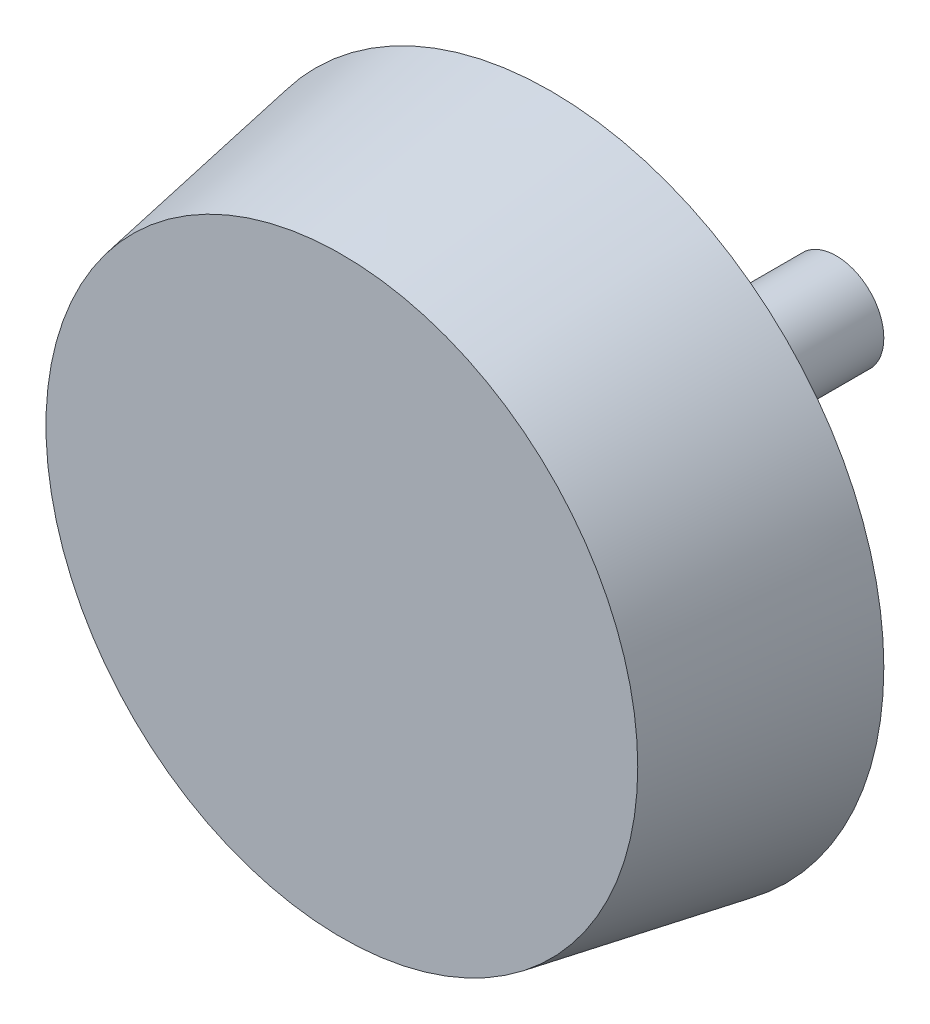
ISO-10303-21;
HEADER;
FILE_DESCRIPTION(('STEP AP214'),'2;1');
FILE_NAME('part.step','',(''),(''),'','','');
FILE_SCHEMA(('AUTOMOTIVE_DESIGN { 1 0 10303 214 1 1 1 1 }'));
ENDSEC;
DATA;
#1=APPLICATION_CONTEXT('core data for automotive mechanical design processes');
#2=APPLICATION_PROTOCOL_DEFINITION('international standard','automotive_design',2000,#1);
#3=PRODUCT_CONTEXT('',#1,'mechanical');
#4=PRODUCT('Part','Part','',(#3));
#5=PRODUCT_RELATED_PRODUCT_CATEGORY('part','',(#4));
#6=PRODUCT_DEFINITION_FORMATION('','',#4);
#7=PRODUCT_DEFINITION_CONTEXT('part definition',#1,'design');
#8=PRODUCT_DEFINITION('design','',#6,#7);
#9=PRODUCT_DEFINITION_SHAPE('','',#8);
#10=(LENGTH_UNIT() NAMED_UNIT(*) SI_UNIT(.MILLI.,.METRE.));
#11=(NAMED_UNIT(*) PLANE_ANGLE_UNIT() SI_UNIT($,.RADIAN.));
#12=(NAMED_UNIT(*) SI_UNIT($,.STERADIAN.) SOLID_ANGLE_UNIT());
#13=UNCERTAINTY_MEASURE_WITH_UNIT(LENGTH_MEASURE(1.E-05),#10,'distance_accuracy_value','');
#14=(GEOMETRIC_REPRESENTATION_CONTEXT(3) GLOBAL_UNCERTAINTY_ASSIGNED_CONTEXT((#13)) GLOBAL_UNIT_ASSIGNED_CONTEXT((#10,
#11,#12)) REPRESENTATION_CONTEXT('',''));
#15=CARTESIAN_POINT('',(0.,0.,0.));
#16=DIRECTION('',(0.,0.,1.));
#17=DIRECTION('',(1.,0.,0.));
#18=AXIS2_PLACEMENT_3D('',#15,#16,#17);
#19=CARTESIAN_POINT('',(0.,0.,0.));
#20=DIRECTION('',(0.,0.,1.));
#21=DIRECTION('',(1.,0.,0.));
#22=AXIS2_PLACEMENT_3D('',#19,#20,#21);
#23=PLANE('',#22);
#24=CARTESIAN_POINT('',(0.,0.,0.));
#25=DIRECTION('',(0.,0.,1.));
#26=DIRECTION('',(1.,0.,0.));
#27=AXIS2_PLACEMENT_3D('',#24,#25,#26);
#28=CIRCLE('',#27,35.);
#29=CARTESIAN_POINT('',(35.,0.,0.));
#30=VERTEX_POINT('',#29);
#31=EDGE_CURVE('E41',#30,#30,#28,.T.);
#32=ORIENTED_EDGE('',*,*,#31,.F.);
#33=EDGE_LOOP('',(#32));
#34=FACE_BOUND('',#33,.T.);
#35=CARTESIAN_POINT('',(0.,0.,0.));
#36=DIRECTION('',(0.,0.,1.));
#37=DIRECTION('',(1.,0.,0.));
#38=AXIS2_PLACEMENT_3D('',#35,#36,#37);
#39=CIRCLE('',#38,5.);
#40=CARTESIAN_POINT('',(5.,0.,0.));
#41=VERTEX_POINT('',#40);
#42=EDGE_CURVE('E10',#41,#41,#39,.F.);
#43=ORIENTED_EDGE('',*,*,#42,.F.);
#44=EDGE_LOOP('',(#43));
#45=FACE_BOUND('',#44,.T.);
#46=ADVANCED_FACE('F30',(#34,#45),#23,.F.);
#47=CARTESIAN_POINT('',(0.,0.,0.));
#48=DIRECTION('',(0.,0.,-1.));
#49=DIRECTION('',(1.,0.,0.));
#50=AXIS2_PLACEMENT_3D('',#47,#48,#49);
#51=CONICAL_SURFACE('',#50,35.,0.174532925199433);
#52=CARTESIAN_POINT('',(0.,0.,22.));
#53=DIRECTION('',(0.,0.,1.));
#54=DIRECTION('',(1.,0.,0.));
#55=AXIS2_PLACEMENT_3D('',#52,#53,#54);
#56=CIRCLE('',#55,31.1208064244138);
#57=CARTESIAN_POINT('',(31.1208064244138,0.,22.));
#58=VERTEX_POINT('',#57);
#59=EDGE_CURVE('E37',#58,#58,#56,.T.);
#60=ORIENTED_EDGE('',*,*,#59,.F.);
#61=EDGE_LOOP('',(#60));
#62=FACE_BOUND('',#61,.T.);
#63=ORIENTED_EDGE('',*,*,#31,.T.);
#64=EDGE_LOOP('',(#63));
#65=FACE_BOUND('',#64,.T.);
#66=ADVANCED_FACE('F32',(#62,#65),#51,.T.);
#67=CARTESIAN_POINT('',(0.,0.,22.));
#68=DIRECTION('',(0.,0.,1.));
#69=DIRECTION('',(1.,0.,0.));
#70=AXIS2_PLACEMENT_3D('',#67,#68,#69);
#71=PLANE('',#70);
#72=ORIENTED_EDGE('',*,*,#59,.T.);
#73=EDGE_LOOP('',(#72));
#74=FACE_BOUND('',#73,.T.);
#75=ADVANCED_FACE('F55',(#74),#71,.T.);
#76=CARTESIAN_POINT('',(0.,0.,-30.));
#77=DIRECTION('',(0.,0.,1.));
#78=DIRECTION('',(1.,0.,0.));
#79=AXIS2_PLACEMENT_3D('',#76,#77,#78);
#80=CYLINDRICAL_SURFACE('',#79,5.);
#81=CARTESIAN_POINT('',(0.,0.,-30.));
#82=DIRECTION('',(0.,0.,-1.));
#83=DIRECTION('',(-1.,0.,0.));
#84=AXIS2_PLACEMENT_3D('',#81,#82,#83);
#85=CIRCLE('',#84,5.);
#86=CARTESIAN_POINT('',(-5.,0.,-30.));
#87=VERTEX_POINT('',#86);
#88=EDGE_CURVE('E45',#87,#87,#85,.T.);
#89=ORIENTED_EDGE('',*,*,#88,.F.);
#90=EDGE_LOOP('',(#89));
#91=FACE_BOUND('',#90,.T.);
#92=ORIENTED_EDGE('',*,*,#42,.T.);
#93=EDGE_LOOP('',(#92));
#94=FACE_BOUND('',#93,.T.);
#95=ADVANCED_FACE('F53',(#91,#94),#80,.T.);
#96=CARTESIAN_POINT('',(0.,0.,-30.));
#97=DIRECTION('',(0.,0.,-1.));
#98=DIRECTION('',(-1.,0.,0.));
#99=AXIS2_PLACEMENT_3D('',#96,#97,#98);
#100=PLANE('',#99);
#101=ORIENTED_EDGE('',*,*,#88,.T.);
#102=EDGE_LOOP('',(#101));
#103=FACE_BOUND('',#102,.T.);
#104=ADVANCED_FACE('F51',(#103),#100,.T.);
#105=CLOSED_SHELL('',(#46,#66,#75,#95,#104));
#106=MANIFOLD_SOLID_BREP('B2',#105);
#107=ADVANCED_BREP_SHAPE_REPRESENTATION('',(#18,#106),#14);
#108=SHAPE_DEFINITION_REPRESENTATION(#9,#107);
ENDSEC;
END-ISO-10303-21;
